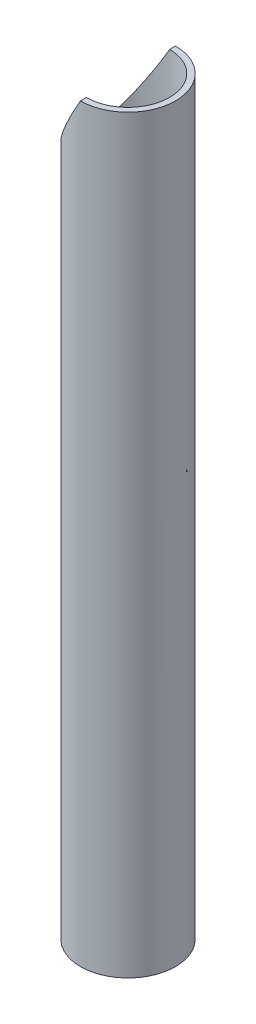
ISO-10303-21;
HEADER;
FILE_DESCRIPTION(('STEP AP214'),'2;1');
FILE_NAME('part.step','',(''),(''),'','','');
FILE_SCHEMA(('AUTOMOTIVE_DESIGN { 1 0 10303 214 1 1 1 1 }'));
ENDSEC;
DATA;
#1=APPLICATION_CONTEXT('core data for automotive mechanical design processes');
#2=APPLICATION_PROTOCOL_DEFINITION('international standard','automotive_design',2000,#1);
#3=PRODUCT_CONTEXT('',#1,'mechanical');
#4=PRODUCT('Part','Part','',(#3));
#5=PRODUCT_RELATED_PRODUCT_CATEGORY('part','',(#4));
#6=PRODUCT_DEFINITION_FORMATION('','',#4);
#7=PRODUCT_DEFINITION_CONTEXT('part definition',#1,'design');
#8=PRODUCT_DEFINITION('design','',#6,#7);
#9=PRODUCT_DEFINITION_SHAPE('','',#8);
#10=(LENGTH_UNIT() NAMED_UNIT(*) SI_UNIT(.MILLI.,.METRE.));
#11=(NAMED_UNIT(*) PLANE_ANGLE_UNIT() SI_UNIT($,.RADIAN.));
#12=(NAMED_UNIT(*) SI_UNIT($,.STERADIAN.) SOLID_ANGLE_UNIT());
#13=UNCERTAINTY_MEASURE_WITH_UNIT(LENGTH_MEASURE(1.E-05),#10,'distance_accuracy_value','');
#14=(GEOMETRIC_REPRESENTATION_CONTEXT(3) GLOBAL_UNCERTAINTY_ASSIGNED_CONTEXT((#13)) GLOBAL_UNIT_ASSIGNED_CONTEXT((#10,
#11,#12)) REPRESENTATION_CONTEXT('',''));
#15=CARTESIAN_POINT('',(0.,0.,0.));
#16=DIRECTION('',(0.,0.,1.));
#17=DIRECTION('',(1.,0.,0.));
#18=AXIS2_PLACEMENT_3D('',#15,#16,#17);
#19=CARTESIAN_POINT('',(0.,126.216017177982,0.));
#20=DIRECTION('',(0.,1.,0.));
#21=DIRECTION('',(0.,0.,1.));
#22=AXIS2_PLACEMENT_3D('',#19,#20,#21);
#23=PLANE('',#22);
#24=CARTESIAN_POINT('',(0.,126.216017177982,0.));
#25=DIRECTION('',(0.,1.,0.));
#26=DIRECTION('',(0.,0.,1.));
#27=AXIS2_PLACEMENT_3D('',#24,#25,#26);
#28=CIRCLE('',#27,8.);
#29=CARTESIAN_POINT('',(0.,126.216017177982,8.));
#30=VERTEX_POINT('',#29);
#31=CARTESIAN_POINT('',(0.,126.216017177982,-8.));
#32=VERTEX_POINT('',#31);
#33=EDGE_CURVE('E47',#30,#32,#28,.T.);
#34=ORIENTED_EDGE('',*,*,#33,.T.);
#35=DIRECTION('',(0.,0.,-1.));
#36=VECTOR('',#35,1.);
#37=CARTESIAN_POINT('',(0.,126.216017177982,25.));
#38=LINE('',#37,#36);
#39=CARTESIAN_POINT('',(0.,126.216017177982,-7.));
#40=VERTEX_POINT('',#39);
#41=EDGE_CURVE('E66',#40,#32,#38,.T.);
#42=ORIENTED_EDGE('',*,*,#41,.F.);
#43=CARTESIAN_POINT('',(0.,126.216017177982,0.));
#44=DIRECTION('',(0.,1.,0.));
#45=DIRECTION('',(0.,0.,1.));
#46=AXIS2_PLACEMENT_3D('',#43,#44,#45);
#47=CIRCLE('',#46,7.);
#48=CARTESIAN_POINT('',(0.,126.216017177982,7.));
#49=VERTEX_POINT('',#48);
#50=EDGE_CURVE('E74',#49,#40,#47,.T.);
#51=ORIENTED_EDGE('',*,*,#50,.F.);
#52=EDGE_CURVE('E54',#30,#49,#38,.T.);
#53=ORIENTED_EDGE('',*,*,#52,.F.);
#54=EDGE_LOOP('',(#34,#42,#51,#53));
#55=FACE_BOUND('',#54,.T.);
#56=ADVANCED_FACE('F38',(#55),#23,.T.);
#57=CARTESIAN_POINT('',(0.,126.216017177982,0.));
#58=DIRECTION('',(0.,-1.,0.));
#59=DIRECTION('',(0.,0.,-1.));
#60=AXIS2_PLACEMENT_3D('',#57,#58,#59);
#61=CYLINDRICAL_SURFACE('',#60,8.);
#62=CARTESIAN_POINT('',(0.,0.,0.));
#63=DIRECTION('',(0.,1.,0.));
#64=DIRECTION('',(0.,0.,1.));
#65=AXIS2_PLACEMENT_3D('',#62,#63,#64);
#66=CIRCLE('',#65,8.);
#67=CARTESIAN_POINT('',(0.,0.,8.));
#68=VERTEX_POINT('',#67);
#69=EDGE_CURVE('E78',#68,#68,#66,.T.);
#70=ORIENTED_EDGE('',*,*,#69,.T.);
#71=EDGE_LOOP('',(#70));
#72=FACE_BOUND('',#71,.T.);
#73=CARTESIAN_POINT('',(0.,126.216017177982,0.));
#74=DIRECTION('',(-0.866025403784436,0.500000000000004,0.));
#75=DIRECTION('',(-0.500000000000004,-0.866025403784436,0.));
#76=AXIS2_PLACEMENT_3D('',#73,#74,#75);
#77=ELLIPSE('',#76,15.9999999999999,8.);
#78=EDGE_CURVE('E59',#32,#30,#77,.T.);
#79=ORIENTED_EDGE('',*,*,#78,.F.);
#80=ORIENTED_EDGE('',*,*,#33,.F.);
#81=EDGE_LOOP('',(#79,#80));
#82=FACE_BOUND('',#81,.T.);
#83=ADVANCED_FACE('F40',(#72,#82),#61,.T.);
#84=CARTESIAN_POINT('',(0.,126.216017177982,0.));
#85=DIRECTION('',(0.,-1.,0.));
#86=DIRECTION('',(0.,0.,-1.));
#87=AXIS2_PLACEMENT_3D('',#84,#85,#86);
#88=CYLINDRICAL_SURFACE('',#87,7.);
#89=CARTESIAN_POINT('',(0.,0.,0.));
#90=DIRECTION('',(0.,1.,0.));
#91=DIRECTION('',(0.,0.,1.));
#92=AXIS2_PLACEMENT_3D('',#89,#90,#91);
#93=CIRCLE('',#92,7.);
#94=CARTESIAN_POINT('',(0.,0.,7.));
#95=VERTEX_POINT('',#94);
#96=EDGE_CURVE('E69',#95,#95,#93,.T.);
#97=ORIENTED_EDGE('',*,*,#96,.F.);
#98=EDGE_LOOP('',(#97));
#99=FACE_BOUND('',#98,.T.);
#100=ORIENTED_EDGE('',*,*,#50,.T.);
#101=CARTESIAN_POINT('',(0.,126.216017177982,0.));
#102=DIRECTION('',(-0.866025403784436,0.500000000000004,0.));
#103=DIRECTION('',(-0.500000000000004,-0.866025403784436,0.));
#104=AXIS2_PLACEMENT_3D('',#101,#102,#103);
#105=ELLIPSE('',#104,13.9999999999999,7.);
#106=EDGE_CURVE('E11',#40,#49,#105,.T.);
#107=ORIENTED_EDGE('',*,*,#106,.T.);
#108=EDGE_LOOP('',(#100,#107));
#109=FACE_BOUND('',#108,.T.);
#110=ADVANCED_FACE('F89',(#99,#109),#88,.F.);
#111=CARTESIAN_POINT('',(0.,0.,0.));
#112=DIRECTION('',(0.,1.,0.));
#113=DIRECTION('',(0.,0.,1.));
#114=AXIS2_PLACEMENT_3D('',#111,#112,#113);
#115=PLANE('',#114);
#116=ORIENTED_EDGE('',*,*,#69,.F.);
#117=EDGE_LOOP('',(#116));
#118=FACE_BOUND('',#117,.T.);
#119=ORIENTED_EDGE('',*,*,#96,.T.);
#120=EDGE_LOOP('',(#119));
#121=FACE_BOUND('',#120,.T.);
#122=ADVANCED_FACE('F91',(#118,#121),#115,.F.);
#123=CARTESIAN_POINT('',(0.,126.216017177982,25.));
#124=DIRECTION('',(-0.866025403784436,0.500000000000004,0.));
#125=DIRECTION('',(-0.500000000000004,-0.866025403784436,0.));
#126=AXIS2_PLACEMENT_3D('',#123,#124,#125);
#127=PLANE('',#126);
#128=ORIENTED_EDGE('',*,*,#78,.T.);
#129=ORIENTED_EDGE('',*,*,#52,.T.);
#130=ORIENTED_EDGE('',*,*,#106,.F.);
#131=ORIENTED_EDGE('',*,*,#41,.T.);
#132=EDGE_LOOP('',(#128,#129,#130,#131));
#133=FACE_BOUND('',#132,.T.);
#134=ADVANCED_FACE('F64',(#133),#127,.T.);
#135=CLOSED_SHELL('',(#56,#83,#110,#122,#134));
#136=MANIFOLD_SOLID_BREP('B2',#135);
#137=ADVANCED_BREP_SHAPE_REPRESENTATION('',(#18,#136),#14);
#138=SHAPE_DEFINITION_REPRESENTATION(#9,#137);
ENDSEC;
END-ISO-10303-21;
